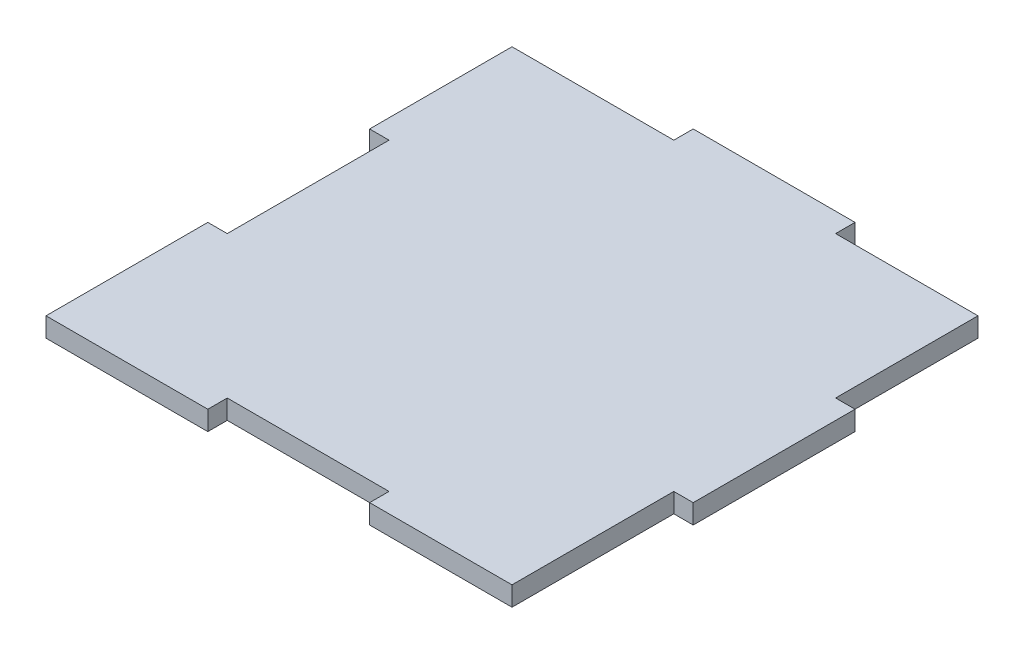
ISO-10303-21;
HEADER;
FILE_DESCRIPTION(('STEP AP214'),'2;1');
FILE_NAME('part.step','',(''),(''),'','','');
FILE_SCHEMA(('AUTOMOTIVE_DESIGN { 1 0 10303 214 1 1 1 1 }'));
ENDSEC;
DATA;
#1=APPLICATION_CONTEXT('core data for automotive mechanical design processes');
#2=APPLICATION_PROTOCOL_DEFINITION('international standard','automotive_design',2000,#1);
#3=PRODUCT_CONTEXT('',#1,'mechanical');
#4=PRODUCT('Part','Part','',(#3));
#5=PRODUCT_RELATED_PRODUCT_CATEGORY('part','',(#4));
#6=PRODUCT_DEFINITION_FORMATION('','',#4);
#7=PRODUCT_DEFINITION_CONTEXT('part definition',#1,'design');
#8=PRODUCT_DEFINITION('design','',#6,#7);
#9=PRODUCT_DEFINITION_SHAPE('','',#8);
#10=(LENGTH_UNIT() NAMED_UNIT(*) SI_UNIT(.MILLI.,.METRE.));
#11=(NAMED_UNIT(*) PLANE_ANGLE_UNIT() SI_UNIT($,.RADIAN.));
#12=(NAMED_UNIT(*) SI_UNIT($,.STERADIAN.) SOLID_ANGLE_UNIT());
#13=UNCERTAINTY_MEASURE_WITH_UNIT(LENGTH_MEASURE(1.E-05),#10,'distance_accuracy_value','');
#14=(GEOMETRIC_REPRESENTATION_CONTEXT(3) GLOBAL_UNCERTAINTY_ASSIGNED_CONTEXT((#13)) GLOBAL_UNIT_ASSIGNED_CONTEXT((#10,
#11,#12)) REPRESENTATION_CONTEXT('',''));
#15=CARTESIAN_POINT('',(0.,0.,0.));
#16=DIRECTION('',(0.,0.,1.));
#17=DIRECTION('',(1.,0.,0.));
#18=AXIS2_PLACEMENT_3D('',#15,#16,#17);
#19=CARTESIAN_POINT('',(0.,6.,22.));
#20=DIRECTION('',(0.,0.,-1.));
#21=DIRECTION('',(-1.,0.,0.));
#22=AXIS2_PLACEMENT_3D('',#19,#20,#21);
#23=PLANE('',#22);
#24=DIRECTION('',(1.,0.,0.));
#25=VECTOR('',#24,1.);
#26=CARTESIAN_POINT('',(0.,0.,22.));
#27=LINE('',#26,#25);
#28=CARTESIAN_POINT('',(-72.,0.,22.));
#29=VERTEX_POINT('',#28);
#30=CARTESIAN_POINT('',(-66.,0.,22.));
#31=VERTEX_POINT('',#30);
#32=EDGE_CURVE('E266',#29,#31,#27,.T.);
#33=ORIENTED_EDGE('',*,*,#32,.F.);
#34=DIRECTION('',(0.,-1.,0.));
#35=VECTOR('',#34,1.);
#36=CARTESIAN_POINT('',(-72.,6.,22.));
#37=LINE('',#36,#35);
#38=CARTESIAN_POINT('',(-72.,6.,22.));
#39=VERTEX_POINT('',#38);
#40=EDGE_CURVE('E11',#39,#29,#37,.T.);
#41=ORIENTED_EDGE('',*,*,#40,.F.);
#42=DIRECTION('',(1.,0.,0.));
#43=VECTOR('',#42,1.);
#44=CARTESIAN_POINT('',(0.,6.,22.));
#45=LINE('',#44,#43);
#46=CARTESIAN_POINT('',(-66.,6.,22.));
#47=VERTEX_POINT('',#46);
#48=EDGE_CURVE('E202',#39,#47,#45,.T.);
#49=ORIENTED_EDGE('',*,*,#48,.T.);
#50=DIRECTION('',(0.,-1.,0.));
#51=VECTOR('',#50,1.);
#52=CARTESIAN_POINT('',(-66.,6.,22.));
#53=LINE('',#52,#51);
#54=EDGE_CURVE('E119',#47,#31,#53,.T.);
#55=ORIENTED_EDGE('',*,*,#54,.T.);
#56=EDGE_LOOP('',(#33,#41,#49,#55));
#57=FACE_BOUND('',#56,.T.);
#58=ADVANCED_FACE('F33',(#57),#23,.T.);
#59=CARTESIAN_POINT('',(-72.,6.,0.));
#60=DIRECTION('',(-1.,0.,0.));
#61=DIRECTION('',(0.,0.,1.));
#62=AXIS2_PLACEMENT_3D('',#59,#60,#61);
#63=PLANE('',#62);
#64=DIRECTION('',(0.,0.,-1.));
#65=VECTOR('',#64,1.);
#66=CARTESIAN_POINT('',(-72.,0.,0.));
#67=LINE('',#66,#65);
#68=CARTESIAN_POINT('',(-72.,0.,72.));
#69=VERTEX_POINT('',#68);
#70=EDGE_CURVE('E260',#69,#29,#67,.T.);
#71=ORIENTED_EDGE('',*,*,#70,.F.);
#72=DIRECTION('',(0.,-1.,0.));
#73=VECTOR('',#72,1.);
#74=CARTESIAN_POINT('',(-72.,6.,72.));
#75=LINE('',#74,#73);
#76=CARTESIAN_POINT('',(-72.,6.,72.));
#77=VERTEX_POINT('',#76);
#78=EDGE_CURVE('E41',#77,#69,#75,.T.);
#79=ORIENTED_EDGE('',*,*,#78,.F.);
#80=DIRECTION('',(0.,0.,-1.));
#81=VECTOR('',#80,1.);
#82=CARTESIAN_POINT('',(-72.,6.,0.));
#83=LINE('',#82,#81);
#84=EDGE_CURVE('E194',#77,#39,#83,.T.);
#85=ORIENTED_EDGE('',*,*,#84,.T.);
#86=ORIENTED_EDGE('',*,*,#40,.T.);
#87=EDGE_LOOP('',(#71,#79,#85,#86));
#88=FACE_BOUND('',#87,.T.);
#89=ADVANCED_FACE('F265',(#88),#63,.T.);
#90=CARTESIAN_POINT('',(0.,6.,72.));
#91=DIRECTION('',(0.,0.,-1.));
#92=DIRECTION('',(-1.,0.,0.));
#93=AXIS2_PLACEMENT_3D('',#90,#91,#92);
#94=PLANE('',#93);
#95=DIRECTION('',(1.,0.,0.));
#96=VECTOR('',#95,1.);
#97=CARTESIAN_POINT('',(0.,0.,72.));
#98=LINE('',#97,#96);
#99=CARTESIAN_POINT('',(-22.,0.,72.));
#100=VERTEX_POINT('',#99);
#101=EDGE_CURVE('E254',#69,#100,#98,.T.);
#102=ORIENTED_EDGE('',*,*,#101,.T.);
#103=DIRECTION('',(0.,-1.,0.));
#104=VECTOR('',#103,1.);
#105=CARTESIAN_POINT('',(-22.,6.,72.));
#106=LINE('',#105,#104);
#107=CARTESIAN_POINT('',(-22.,6.,72.));
#108=VERTEX_POINT('',#107);
#109=EDGE_CURVE('E247',#108,#100,#106,.T.);
#110=ORIENTED_EDGE('',*,*,#109,.F.);
#111=DIRECTION('',(1.,0.,0.));
#112=VECTOR('',#111,1.);
#113=CARTESIAN_POINT('',(0.,6.,72.));
#114=LINE('',#113,#112);
#115=EDGE_CURVE('E201',#77,#108,#114,.T.);
#116=ORIENTED_EDGE('',*,*,#115,.F.);
#117=ORIENTED_EDGE('',*,*,#78,.T.);
#118=EDGE_LOOP('',(#102,#110,#116,#117));
#119=FACE_BOUND('',#118,.T.);
#120=ADVANCED_FACE('F252',(#119),#94,.F.);
#121=CARTESIAN_POINT('',(-22.,6.,0.));
#122=DIRECTION('',(-1.,0.,0.));
#123=DIRECTION('',(0.,0.,1.));
#124=AXIS2_PLACEMENT_3D('',#121,#122,#123);
#125=PLANE('',#124);
#126=DIRECTION('',(0.,0.,-1.));
#127=VECTOR('',#126,1.);
#128=CARTESIAN_POINT('',(-22.,0.,0.));
#129=LINE('',#128,#127);
#130=CARTESIAN_POINT('',(-22.,0.,66.));
#131=VERTEX_POINT('',#130);
#132=EDGE_CURVE('E262',#100,#131,#129,.T.);
#133=ORIENTED_EDGE('',*,*,#132,.T.);
#134=DIRECTION('',(0.,-1.,0.));
#135=VECTOR('',#134,1.);
#136=CARTESIAN_POINT('',(-22.,6.,66.));
#137=LINE('',#136,#135);
#138=CARTESIAN_POINT('',(-22.,6.,66.));
#139=VERTEX_POINT('',#138);
#140=EDGE_CURVE('E244',#139,#131,#137,.T.);
#141=ORIENTED_EDGE('',*,*,#140,.F.);
#142=DIRECTION('',(0.,0.,-1.));
#143=VECTOR('',#142,1.);
#144=CARTESIAN_POINT('',(-22.,6.,0.));
#145=LINE('',#144,#143);
#146=EDGE_CURVE('E205',#108,#139,#145,.T.);
#147=ORIENTED_EDGE('',*,*,#146,.F.);
#148=ORIENTED_EDGE('',*,*,#109,.T.);
#149=EDGE_LOOP('',(#133,#141,#147,#148));
#150=FACE_BOUND('',#149,.T.);
#151=ADVANCED_FACE('F394',(#150),#125,.F.);
#152=CARTESIAN_POINT('',(0.,6.,66.));
#153=DIRECTION('',(0.,0.,-1.));
#154=DIRECTION('',(-1.,0.,0.));
#155=AXIS2_PLACEMENT_3D('',#152,#153,#154);
#156=PLANE('',#155);
#157=DIRECTION('',(1.,0.,0.));
#158=VECTOR('',#157,1.);
#159=CARTESIAN_POINT('',(0.,0.,66.));
#160=LINE('',#159,#158);
#161=CARTESIAN_POINT('',(28.,0.,66.));
#162=VERTEX_POINT('',#161);
#163=EDGE_CURVE('E306',#131,#162,#160,.T.);
#164=ORIENTED_EDGE('',*,*,#163,.T.);
#165=DIRECTION('',(0.,-1.,0.));
#166=VECTOR('',#165,1.);
#167=CARTESIAN_POINT('',(28.,6.,66.));
#168=LINE('',#167,#166);
#169=CARTESIAN_POINT('',(28.,6.,66.));
#170=VERTEX_POINT('',#169);
#171=EDGE_CURVE('E242',#170,#162,#168,.T.);
#172=ORIENTED_EDGE('',*,*,#171,.F.);
#173=DIRECTION('',(1.,0.,0.));
#174=VECTOR('',#173,1.);
#175=CARTESIAN_POINT('',(0.,6.,66.));
#176=LINE('',#175,#174);
#177=EDGE_CURVE('E322',#139,#170,#176,.T.);
#178=ORIENTED_EDGE('',*,*,#177,.F.);
#179=ORIENTED_EDGE('',*,*,#140,.T.);
#180=EDGE_LOOP('',(#164,#172,#178,#179));
#181=FACE_BOUND('',#180,.T.);
#182=ADVANCED_FACE('F312',(#181),#156,.F.);
#183=CARTESIAN_POINT('',(28.,6.,0.));
#184=DIRECTION('',(-1.,0.,0.));
#185=DIRECTION('',(0.,0.,1.));
#186=AXIS2_PLACEMENT_3D('',#183,#184,#185);
#187=PLANE('',#186);
#188=DIRECTION('',(0.,0.,-1.));
#189=VECTOR('',#188,1.);
#190=CARTESIAN_POINT('',(28.,0.,0.));
#191=LINE('',#190,#189);
#192=CARTESIAN_POINT('',(28.,0.,72.));
#193=VERTEX_POINT('',#192);
#194=EDGE_CURVE('E301',#193,#162,#191,.T.);
#195=ORIENTED_EDGE('',*,*,#194,.F.);
#196=DIRECTION('',(0.,-1.,0.));
#197=VECTOR('',#196,1.);
#198=CARTESIAN_POINT('',(28.,6.,72.));
#199=LINE('',#198,#197);
#200=CARTESIAN_POINT('',(28.,6.,72.));
#201=VERTEX_POINT('',#200);
#202=EDGE_CURVE('E240',#201,#193,#199,.T.);
#203=ORIENTED_EDGE('',*,*,#202,.F.);
#204=DIRECTION('',(0.,0.,-1.));
#205=VECTOR('',#204,1.);
#206=CARTESIAN_POINT('',(28.,6.,0.));
#207=LINE('',#206,#205);
#208=EDGE_CURVE('E321',#201,#170,#207,.T.);
#209=ORIENTED_EDGE('',*,*,#208,.T.);
#210=ORIENTED_EDGE('',*,*,#171,.T.);
#211=EDGE_LOOP('',(#195,#203,#209,#210));
#212=FACE_BOUND('',#211,.T.);
#213=ADVANCED_FACE('F318',(#212),#187,.T.);
#214=CARTESIAN_POINT('',(72.,0.,72.));
#215=VERTEX_POINT('',#214);
#216=EDGE_CURVE('E264',#193,#215,#98,.T.);
#217=ORIENTED_EDGE('',*,*,#216,.T.);
#218=DIRECTION('',(0.,-1.,0.));
#219=VECTOR('',#218,1.);
#220=CARTESIAN_POINT('',(72.,6.,72.));
#221=LINE('',#220,#219);
#222=CARTESIAN_POINT('',(72.,6.,72.));
#223=VERTEX_POINT('',#222);
#224=EDGE_CURVE('E237',#223,#215,#221,.T.);
#225=ORIENTED_EDGE('',*,*,#224,.F.);
#226=EDGE_CURVE('E206',#201,#223,#114,.T.);
#227=ORIENTED_EDGE('',*,*,#226,.F.);
#228=ORIENTED_EDGE('',*,*,#202,.T.);
#229=EDGE_LOOP('',(#217,#225,#227,#228));
#230=FACE_BOUND('',#229,.T.);
#231=ADVANCED_FACE('F383',(#230),#94,.F.);
#232=CARTESIAN_POINT('',(72.,6.,0.));
#233=DIRECTION('',(-1.,0.,0.));
#234=DIRECTION('',(0.,0.,1.));
#235=AXIS2_PLACEMENT_3D('',#232,#233,#234);
#236=PLANE('',#235);
#237=DIRECTION('',(0.,0.,-1.));
#238=VECTOR('',#237,1.);
#239=CARTESIAN_POINT('',(72.,0.,0.));
#240=LINE('',#239,#238);
#241=CARTESIAN_POINT('',(72.,0.,22.));
#242=VERTEX_POINT('',#241);
#243=EDGE_CURVE('E289',#215,#242,#240,.T.);
#244=ORIENTED_EDGE('',*,*,#243,.T.);
#245=DIRECTION('',(0.,-1.,0.));
#246=VECTOR('',#245,1.);
#247=CARTESIAN_POINT('',(72.,6.,22.));
#248=LINE('',#247,#246);
#249=CARTESIAN_POINT('',(72.,6.,22.));
#250=VERTEX_POINT('',#249);
#251=EDGE_CURVE('E234',#250,#242,#248,.T.);
#252=ORIENTED_EDGE('',*,*,#251,.F.);
#253=DIRECTION('',(0.,0.,-1.));
#254=VECTOR('',#253,1.);
#255=CARTESIAN_POINT('',(72.,6.,0.));
#256=LINE('',#255,#254);
#257=EDGE_CURVE('E324',#223,#250,#256,.T.);
#258=ORIENTED_EDGE('',*,*,#257,.F.);
#259=ORIENTED_EDGE('',*,*,#224,.T.);
#260=EDGE_LOOP('',(#244,#252,#258,#259));
#261=FACE_BOUND('',#260,.T.);
#262=ADVANCED_FACE('F382',(#261),#236,.F.);
#263=CARTESIAN_POINT('',(0.,6.,22.));
#264=DIRECTION('',(0.,0.,-1.));
#265=DIRECTION('',(-1.,0.,0.));
#266=AXIS2_PLACEMENT_3D('',#263,#264,#265);
#267=PLANE('',#266);
#268=DIRECTION('',(1.,0.,0.));
#269=VECTOR('',#268,1.);
#270=CARTESIAN_POINT('',(0.,0.,22.));
#271=LINE('',#270,#269);
#272=CARTESIAN_POINT('',(78.,0.,22.));
#273=VERTEX_POINT('',#272);
#274=EDGE_CURVE('E296',#242,#273,#271,.T.);
#275=ORIENTED_EDGE('',*,*,#274,.T.);
#276=DIRECTION('',(0.,-1.,0.));
#277=VECTOR('',#276,1.);
#278=CARTESIAN_POINT('',(78.,6.,22.));
#279=LINE('',#278,#277);
#280=CARTESIAN_POINT('',(78.,6.,22.));
#281=VERTEX_POINT('',#280);
#282=EDGE_CURVE('E232',#281,#273,#279,.T.);
#283=ORIENTED_EDGE('',*,*,#282,.F.);
#284=DIRECTION('',(1.,0.,0.));
#285=VECTOR('',#284,1.);
#286=CARTESIAN_POINT('',(0.,6.,22.));
#287=LINE('',#286,#285);
#288=EDGE_CURVE('E329',#250,#281,#287,.T.);
#289=ORIENTED_EDGE('',*,*,#288,.F.);
#290=ORIENTED_EDGE('',*,*,#251,.T.);
#291=EDGE_LOOP('',(#275,#283,#289,#290));
#292=FACE_BOUND('',#291,.T.);
#293=ADVANCED_FACE('F380',(#292),#267,.F.);
#294=CARTESIAN_POINT('',(78.,6.,0.));
#295=DIRECTION('',(1.,0.,0.));
#296=DIRECTION('',(0.,0.,-1.));
#297=AXIS2_PLACEMENT_3D('',#294,#295,#296);
#298=PLANE('',#297);
#299=DIRECTION('',(0.,0.,1.));
#300=VECTOR('',#299,1.);
#301=CARTESIAN_POINT('',(78.,0.,0.));
#302=LINE('',#301,#300);
#303=CARTESIAN_POINT('',(78.,0.,-28.));
#304=VERTEX_POINT('',#303);
#305=EDGE_CURVE('E293',#304,#273,#302,.T.);
#306=ORIENTED_EDGE('',*,*,#305,.F.);
#307=DIRECTION('',(0.,-1.,0.));
#308=VECTOR('',#307,1.);
#309=CARTESIAN_POINT('',(78.,6.,-28.));
#310=LINE('',#309,#308);
#311=CARTESIAN_POINT('',(78.,6.,-28.));
#312=VERTEX_POINT('',#311);
#313=EDGE_CURVE('E230',#312,#304,#310,.T.);
#314=ORIENTED_EDGE('',*,*,#313,.F.);
#315=DIRECTION('',(0.,0.,1.));
#316=VECTOR('',#315,1.);
#317=CARTESIAN_POINT('',(78.,6.,0.));
#318=LINE('',#317,#316);
#319=EDGE_CURVE('E332',#312,#281,#318,.T.);
#320=ORIENTED_EDGE('',*,*,#319,.T.);
#321=ORIENTED_EDGE('',*,*,#282,.T.);
#322=EDGE_LOOP('',(#306,#314,#320,#321));
#323=FACE_BOUND('',#322,.T.);
#324=ADVANCED_FACE('F376',(#323),#298,.T.);
#325=CARTESIAN_POINT('',(0.,6.,-28.));
#326=DIRECTION('',(0.,0.,-1.));
#327=DIRECTION('',(-1.,0.,0.));
#328=AXIS2_PLACEMENT_3D('',#325,#326,#327);
#329=PLANE('',#328);
#330=DIRECTION('',(1.,0.,0.));
#331=VECTOR('',#330,1.);
#332=CARTESIAN_POINT('',(0.,0.,-28.));
#333=LINE('',#332,#331);
#334=CARTESIAN_POINT('',(72.,0.,-28.));
#335=VERTEX_POINT('',#334);
#336=EDGE_CURVE('E287',#335,#304,#333,.T.);
#337=ORIENTED_EDGE('',*,*,#336,.F.);
#338=DIRECTION('',(0.,-1.,0.));
#339=VECTOR('',#338,1.);
#340=CARTESIAN_POINT('',(72.,6.,-28.));
#341=LINE('',#340,#339);
#342=CARTESIAN_POINT('',(72.,6.,-28.));
#343=VERTEX_POINT('',#342);
#344=EDGE_CURVE('E228',#343,#335,#341,.T.);
#345=ORIENTED_EDGE('',*,*,#344,.F.);
#346=DIRECTION('',(1.,0.,0.));
#347=VECTOR('',#346,1.);
#348=CARTESIAN_POINT('',(0.,6.,-28.));
#349=LINE('',#348,#347);
#350=EDGE_CURVE('E335',#343,#312,#349,.T.);
#351=ORIENTED_EDGE('',*,*,#350,.T.);
#352=ORIENTED_EDGE('',*,*,#313,.T.);
#353=EDGE_LOOP('',(#337,#345,#351,#352));
#354=FACE_BOUND('',#353,.T.);
#355=ADVANCED_FACE('F370',(#354),#329,.T.);
#356=CARTESIAN_POINT('',(72.,0.,-72.));
#357=VERTEX_POINT('',#356);
#358=EDGE_CURVE('E281',#335,#357,#240,.T.);
#359=ORIENTED_EDGE('',*,*,#358,.T.);
#360=DIRECTION('',(0.,-1.,0.));
#361=VECTOR('',#360,1.);
#362=CARTESIAN_POINT('',(72.,6.,-72.));
#363=LINE('',#362,#361);
#364=CARTESIAN_POINT('',(72.,6.,-72.));
#365=VERTEX_POINT('',#364);
#366=EDGE_CURVE('E226',#365,#357,#363,.T.);
#367=ORIENTED_EDGE('',*,*,#366,.F.);
#368=EDGE_CURVE('E330',#343,#365,#256,.T.);
#369=ORIENTED_EDGE('',*,*,#368,.F.);
#370=ORIENTED_EDGE('',*,*,#344,.T.);
#371=EDGE_LOOP('',(#359,#367,#369,#370));
#372=FACE_BOUND('',#371,.T.);
#373=ADVANCED_FACE('F365',(#372),#236,.F.);
#374=CARTESIAN_POINT('',(0.,6.,-72.));
#375=DIRECTION('',(0.,0.,-1.));
#376=DIRECTION('',(-1.,0.,0.));
#377=AXIS2_PLACEMENT_3D('',#374,#375,#376);
#378=PLANE('',#377);
#379=DIRECTION('',(1.,0.,0.));
#380=VECTOR('',#379,1.);
#381=CARTESIAN_POINT('',(0.,0.,-72.));
#382=LINE('',#381,#380);
#383=CARTESIAN_POINT('',(28.,0.,-72.));
#384=VERTEX_POINT('',#383);
#385=EDGE_CURVE('E273',#384,#357,#382,.T.);
#386=ORIENTED_EDGE('',*,*,#385,.F.);
#387=DIRECTION('',(0.,-1.,0.));
#388=VECTOR('',#387,1.);
#389=CARTESIAN_POINT('',(28.,6.,-72.));
#390=LINE('',#389,#388);
#391=CARTESIAN_POINT('',(28.,6.,-72.));
#392=VERTEX_POINT('',#391);
#393=EDGE_CURVE('E224',#392,#384,#390,.T.);
#394=ORIENTED_EDGE('',*,*,#393,.F.);
#395=DIRECTION('',(1.,0.,0.));
#396=VECTOR('',#395,1.);
#397=CARTESIAN_POINT('',(0.,6.,-72.));
#398=LINE('',#397,#396);
#399=EDGE_CURVE('E197',#392,#365,#398,.T.);
#400=ORIENTED_EDGE('',*,*,#399,.T.);
#401=ORIENTED_EDGE('',*,*,#366,.T.);
#402=EDGE_LOOP('',(#386,#394,#400,#401));
#403=FACE_BOUND('',#402,.T.);
#404=ADVANCED_FACE('F363',(#403),#378,.T.);
#405=CARTESIAN_POINT('',(28.,6.,0.));
#406=DIRECTION('',(-1.,0.,0.));
#407=DIRECTION('',(0.,0.,1.));
#408=AXIS2_PLACEMENT_3D('',#405,#406,#407);
#409=PLANE('',#408);
#410=DIRECTION('',(0.,0.,-1.));
#411=VECTOR('',#410,1.);
#412=CARTESIAN_POINT('',(28.,0.,0.));
#413=LINE('',#412,#411);
#414=CARTESIAN_POINT('',(28.,0.,-78.));
#415=VERTEX_POINT('',#414);
#416=EDGE_CURVE('E280',#384,#415,#413,.T.);
#417=ORIENTED_EDGE('',*,*,#416,.T.);
#418=DIRECTION('',(0.,-1.,0.));
#419=VECTOR('',#418,1.);
#420=CARTESIAN_POINT('',(28.,6.,-78.));
#421=LINE('',#420,#419);
#422=CARTESIAN_POINT('',(28.,6.,-78.));
#423=VERTEX_POINT('',#422);
#424=EDGE_CURVE('E222',#423,#415,#421,.T.);
#425=ORIENTED_EDGE('',*,*,#424,.F.);
#426=DIRECTION('',(0.,0.,-1.));
#427=VECTOR('',#426,1.);
#428=CARTESIAN_POINT('',(28.,6.,0.));
#429=LINE('',#428,#427);
#430=EDGE_CURVE('E339',#392,#423,#429,.T.);
#431=ORIENTED_EDGE('',*,*,#430,.F.);
#432=ORIENTED_EDGE('',*,*,#393,.T.);
#433=EDGE_LOOP('',(#417,#425,#431,#432));
#434=FACE_BOUND('',#433,.T.);
#435=ADVANCED_FACE('F360',(#434),#409,.F.);
#436=CARTESIAN_POINT('',(0.,6.,-78.));
#437=DIRECTION('',(0.,0.,-1.));
#438=DIRECTION('',(-1.,0.,0.));
#439=AXIS2_PLACEMENT_3D('',#436,#437,#438);
#440=PLANE('',#439);
#441=DIRECTION('',(1.,0.,0.));
#442=VECTOR('',#441,1.);
#443=CARTESIAN_POINT('',(0.,0.,-78.));
#444=LINE('',#443,#442);
#445=CARTESIAN_POINT('',(-22.,0.,-78.));
#446=VERTEX_POINT('',#445);
#447=EDGE_CURVE('E276',#446,#415,#444,.T.);
#448=ORIENTED_EDGE('',*,*,#447,.F.);
#449=DIRECTION('',(0.,-1.,0.));
#450=VECTOR('',#449,1.);
#451=CARTESIAN_POINT('',(-22.,6.,-78.));
#452=LINE('',#451,#450);
#453=CARTESIAN_POINT('',(-22.,6.,-78.));
#454=VERTEX_POINT('',#453);
#455=EDGE_CURVE('E220',#454,#446,#452,.T.);
#456=ORIENTED_EDGE('',*,*,#455,.F.);
#457=DIRECTION('',(1.,0.,0.));
#458=VECTOR('',#457,1.);
#459=CARTESIAN_POINT('',(0.,6.,-78.));
#460=LINE('',#459,#458);
#461=EDGE_CURVE('E341',#454,#423,#460,.T.);
#462=ORIENTED_EDGE('',*,*,#461,.T.);
#463=ORIENTED_EDGE('',*,*,#424,.T.);
#464=EDGE_LOOP('',(#448,#456,#462,#463));
#465=FACE_BOUND('',#464,.T.);
#466=ADVANCED_FACE('F356',(#465),#440,.T.);
#467=CARTESIAN_POINT('',(-22.,6.,0.));
#468=DIRECTION('',(-1.,0.,0.));
#469=DIRECTION('',(0.,0.,1.));
#470=AXIS2_PLACEMENT_3D('',#467,#468,#469);
#471=PLANE('',#470);
#472=DIRECTION('',(0.,0.,-1.));
#473=VECTOR('',#472,1.);
#474=CARTESIAN_POINT('',(-22.,0.,0.));
#475=LINE('',#474,#473);
#476=CARTESIAN_POINT('',(-22.,0.,-72.));
#477=VERTEX_POINT('',#476);
#478=EDGE_CURVE('E271',#477,#446,#475,.T.);
#479=ORIENTED_EDGE('',*,*,#478,.F.);
#480=DIRECTION('',(0.,-1.,0.));
#481=VECTOR('',#480,1.);
#482=CARTESIAN_POINT('',(-22.,6.,-72.));
#483=LINE('',#482,#481);
#484=CARTESIAN_POINT('',(-22.,6.,-72.));
#485=VERTEX_POINT('',#484);
#486=EDGE_CURVE('E218',#485,#477,#483,.T.);
#487=ORIENTED_EDGE('',*,*,#486,.F.);
#488=DIRECTION('',(0.,0.,-1.));
#489=VECTOR('',#488,1.);
#490=CARTESIAN_POINT('',(-22.,6.,0.));
#491=LINE('',#490,#489);
#492=EDGE_CURVE('E195',#485,#454,#491,.T.);
#493=ORIENTED_EDGE('',*,*,#492,.T.);
#494=ORIENTED_EDGE('',*,*,#455,.T.);
#495=EDGE_LOOP('',(#479,#487,#493,#494));
#496=FACE_BOUND('',#495,.T.);
#497=ADVANCED_FACE('F348',(#496),#471,.T.);
#498=CARTESIAN_POINT('',(-72.,0.,-72.));
#499=VERTEX_POINT('',#498);
#500=EDGE_CURVE('E269',#499,#477,#382,.T.);
#501=ORIENTED_EDGE('',*,*,#500,.F.);
#502=DIRECTION('',(0.,-1.,0.));
#503=VECTOR('',#502,1.);
#504=CARTESIAN_POINT('',(-72.,6.,-72.));
#505=LINE('',#504,#503);
#506=CARTESIAN_POINT('',(-72.,6.,-72.));
#507=VERTEX_POINT('',#506);
#508=EDGE_CURVE('E182',#507,#499,#505,.T.);
#509=ORIENTED_EDGE('',*,*,#508,.F.);
#510=EDGE_CURVE('E192',#507,#485,#398,.T.);
#511=ORIENTED_EDGE('',*,*,#510,.T.);
#512=ORIENTED_EDGE('',*,*,#486,.T.);
#513=EDGE_LOOP('',(#501,#509,#511,#512));
#514=FACE_BOUND('',#513,.T.);
#515=ADVANCED_FACE('F352',(#514),#378,.T.);
#516=CARTESIAN_POINT('',(-72.,0.,-27.9999999999999));
#517=VERTEX_POINT('',#516);
#518=EDGE_CURVE('E181',#517,#499,#67,.T.);
#519=ORIENTED_EDGE('',*,*,#518,.F.);
#520=DIRECTION('',(0.,-1.,0.));
#521=VECTOR('',#520,1.);
#522=CARTESIAN_POINT('',(-72.,6.,-27.9999999999999));
#523=LINE('',#522,#521);
#524=CARTESIAN_POINT('',(-72.,6.,-27.9999999999999));
#525=VERTEX_POINT('',#524);
#526=EDGE_CURVE('E175',#525,#517,#523,.T.);
#527=ORIENTED_EDGE('',*,*,#526,.F.);
#528=EDGE_CURVE('E179',#525,#507,#83,.T.);
#529=ORIENTED_EDGE('',*,*,#528,.T.);
#530=ORIENTED_EDGE('',*,*,#508,.T.);
#531=EDGE_LOOP('',(#519,#527,#529,#530));
#532=FACE_BOUND('',#531,.T.);
#533=ADVANCED_FACE('F177',(#532),#63,.T.);
#534=CARTESIAN_POINT('',(0.,6.,-27.9999999999999));
#535=DIRECTION('',(0.,0.,-1.));
#536=DIRECTION('',(-1.,0.,0.));
#537=AXIS2_PLACEMENT_3D('',#534,#535,#536);
#538=PLANE('',#537);
#539=DIRECTION('',(1.,0.,0.));
#540=VECTOR('',#539,1.);
#541=CARTESIAN_POINT('',(0.,0.,-27.9999999999999));
#542=LINE('',#541,#540);
#543=CARTESIAN_POINT('',(-66.,0.,-27.9999999999999));
#544=VERTEX_POINT('',#543);
#545=EDGE_CURVE('E112',#517,#544,#542,.T.);
#546=ORIENTED_EDGE('',*,*,#545,.T.);
#547=DIRECTION('',(0.,-1.,0.));
#548=VECTOR('',#547,1.);
#549=CARTESIAN_POINT('',(-66.,6.,-27.9999999999999));
#550=LINE('',#549,#548);
#551=CARTESIAN_POINT('',(-66.,6.,-27.9999999999999));
#552=VERTEX_POINT('',#551);
#553=EDGE_CURVE('E183',#552,#544,#550,.T.);
#554=ORIENTED_EDGE('',*,*,#553,.F.);
#555=DIRECTION('',(1.,0.,0.));
#556=VECTOR('',#555,1.);
#557=CARTESIAN_POINT('',(0.,6.,-27.9999999999999));
#558=LINE('',#557,#556);
#559=EDGE_CURVE('E185',#525,#552,#558,.T.);
#560=ORIENTED_EDGE('',*,*,#559,.F.);
#561=ORIENTED_EDGE('',*,*,#526,.T.);
#562=EDGE_LOOP('',(#546,#554,#560,#561));
#563=FACE_BOUND('',#562,.T.);
#564=ADVANCED_FACE('F186',(#563),#538,.F.);
#565=CARTESIAN_POINT('',(-66.,6.,0.));
#566=DIRECTION('',(1.,0.,0.));
#567=DIRECTION('',(0.,0.,-1.));
#568=AXIS2_PLACEMENT_3D('',#565,#566,#567);
#569=PLANE('',#568);
#570=DIRECTION('',(0.,0.,1.));
#571=VECTOR('',#570,1.);
#572=CARTESIAN_POINT('',(-66.,0.,0.));
#573=LINE('',#572,#571);
#574=EDGE_CURVE('E207',#544,#31,#573,.T.);
#575=ORIENTED_EDGE('',*,*,#574,.T.);
#576=ORIENTED_EDGE('',*,*,#54,.F.);
#577=DIRECTION('',(0.,0.,1.));
#578=VECTOR('',#577,1.);
#579=CARTESIAN_POINT('',(-66.,6.,0.));
#580=LINE('',#579,#578);
#581=EDGE_CURVE('E49',#552,#47,#580,.T.);
#582=ORIENTED_EDGE('',*,*,#581,.F.);
#583=ORIENTED_EDGE('',*,*,#553,.T.);
#584=EDGE_LOOP('',(#575,#576,#582,#583));
#585=FACE_BOUND('',#584,.T.);
#586=ADVANCED_FACE('F409',(#585),#569,.F.);
#587=CARTESIAN_POINT('',(0.,6.,0.));
#588=DIRECTION('',(0.,1.,0.));
#589=DIRECTION('',(0.,0.,1.));
#590=AXIS2_PLACEMENT_3D('',#587,#588,#589);
#591=PLANE('',#590);
#592=ORIENTED_EDGE('',*,*,#48,.F.);
#593=ORIENTED_EDGE('',*,*,#84,.F.);
#594=ORIENTED_EDGE('',*,*,#115,.T.);
#595=ORIENTED_EDGE('',*,*,#146,.T.);
#596=ORIENTED_EDGE('',*,*,#177,.T.);
#597=ORIENTED_EDGE('',*,*,#208,.F.);
#598=ORIENTED_EDGE('',*,*,#226,.T.);
#599=ORIENTED_EDGE('',*,*,#257,.T.);
#600=ORIENTED_EDGE('',*,*,#288,.T.);
#601=ORIENTED_EDGE('',*,*,#319,.F.);
#602=ORIENTED_EDGE('',*,*,#350,.F.);
#603=ORIENTED_EDGE('',*,*,#368,.T.);
#604=ORIENTED_EDGE('',*,*,#399,.F.);
#605=ORIENTED_EDGE('',*,*,#430,.T.);
#606=ORIENTED_EDGE('',*,*,#461,.F.);
#607=ORIENTED_EDGE('',*,*,#492,.F.);
#608=ORIENTED_EDGE('',*,*,#510,.F.);
#609=ORIENTED_EDGE('',*,*,#528,.F.);
#610=ORIENTED_EDGE('',*,*,#559,.T.);
#611=ORIENTED_EDGE('',*,*,#581,.T.);
#612=EDGE_LOOP('',(#592,#593,#594,#595,#596,#597,#598,#599,#600,#601,#602,#603,#604,#605,#606,
#607,#608,#609,#610,#611));
#613=FACE_BOUND('',#612,.T.);
#614=ADVANCED_FACE('F189',(#613),#591,.T.);
#615=CARTESIAN_POINT('',(0.,0.,0.));
#616=DIRECTION('',(0.,1.,0.));
#617=DIRECTION('',(0.,0.,1.));
#618=AXIS2_PLACEMENT_3D('',#615,#616,#617);
#619=PLANE('',#618);
#620=ORIENTED_EDGE('',*,*,#32,.T.);
#621=ORIENTED_EDGE('',*,*,#574,.F.);
#622=ORIENTED_EDGE('',*,*,#545,.F.);
#623=ORIENTED_EDGE('',*,*,#518,.T.);
#624=ORIENTED_EDGE('',*,*,#500,.T.);
#625=ORIENTED_EDGE('',*,*,#478,.T.);
#626=ORIENTED_EDGE('',*,*,#447,.T.);
#627=ORIENTED_EDGE('',*,*,#416,.F.);
#628=ORIENTED_EDGE('',*,*,#385,.T.);
#629=ORIENTED_EDGE('',*,*,#358,.F.);
#630=ORIENTED_EDGE('',*,*,#336,.T.);
#631=ORIENTED_EDGE('',*,*,#305,.T.);
#632=ORIENTED_EDGE('',*,*,#274,.F.);
#633=ORIENTED_EDGE('',*,*,#243,.F.);
#634=ORIENTED_EDGE('',*,*,#216,.F.);
#635=ORIENTED_EDGE('',*,*,#194,.T.);
#636=ORIENTED_EDGE('',*,*,#163,.F.);
#637=ORIENTED_EDGE('',*,*,#132,.F.);
#638=ORIENTED_EDGE('',*,*,#101,.F.);
#639=ORIENTED_EDGE('',*,*,#70,.T.);
#640=EDGE_LOOP('',(#620,#621,#622,#623,#624,#625,#626,#627,#628,#629,#630,#631,#632,#633,#634,
#635,#636,#637,#638,#639));
#641=FACE_BOUND('',#640,.T.);
#642=ADVANCED_FACE('F259',(#641),#619,.F.);
#643=CLOSED_SHELL('',(#58,#89,#120,#151,#182,#213,#231,#262,#293,#324,#355,#373,#404,#435,#466,
#497,#515,#533,#564,#586,#614,#642));
#644=MANIFOLD_SOLID_BREP('B2',#643);
#645=ADVANCED_BREP_SHAPE_REPRESENTATION('',(#18,#644),#14);
#646=SHAPE_DEFINITION_REPRESENTATION(#9,#645);
ENDSEC;
END-ISO-10303-21;
